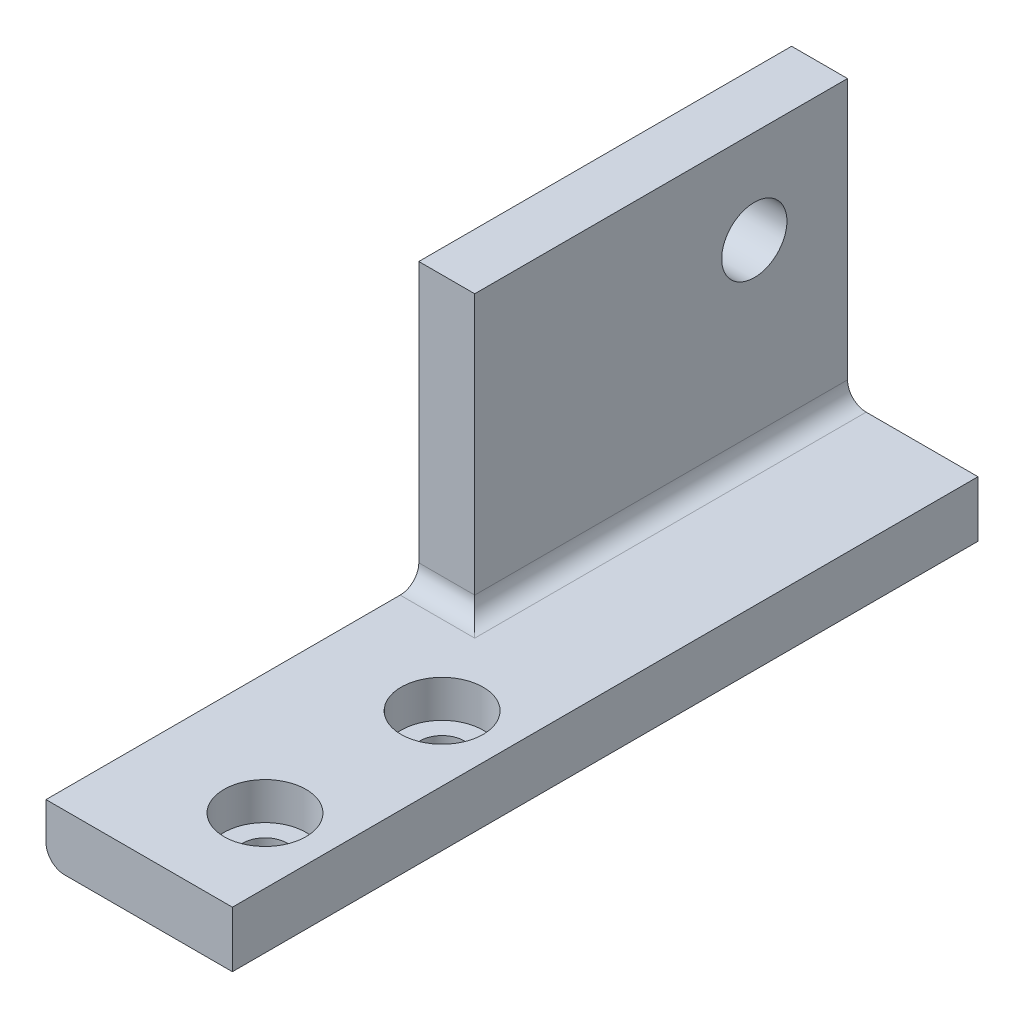
ISO-10303-21;
HEADER;
FILE_DESCRIPTION(('STEP AP214'),'2;1');
FILE_NAME('part.step','',(''),(''),'','','');
FILE_SCHEMA(('AUTOMOTIVE_DESIGN { 1 0 10303 214 1 1 1 1 }'));
ENDSEC;
DATA;
#1=APPLICATION_CONTEXT('core data for automotive mechanical design processes');
#2=APPLICATION_PROTOCOL_DEFINITION('international standard','automotive_design',2000,#1);
#3=PRODUCT_CONTEXT('',#1,'mechanical');
#4=PRODUCT('Part','Part','',(#3));
#5=PRODUCT_RELATED_PRODUCT_CATEGORY('part','',(#4));
#6=PRODUCT_DEFINITION_FORMATION('','',#4);
#7=PRODUCT_DEFINITION_CONTEXT('part definition',#1,'design');
#8=PRODUCT_DEFINITION('design','',#6,#7);
#9=PRODUCT_DEFINITION_SHAPE('','',#8);
#10=(LENGTH_UNIT() NAMED_UNIT(*) SI_UNIT(.MILLI.,.METRE.));
#11=(NAMED_UNIT(*) PLANE_ANGLE_UNIT() SI_UNIT($,.RADIAN.));
#12=(NAMED_UNIT(*) SI_UNIT($,.STERADIAN.) SOLID_ANGLE_UNIT());
#13=UNCERTAINTY_MEASURE_WITH_UNIT(LENGTH_MEASURE(1.E-05),#10,'distance_accuracy_value','');
#14=(GEOMETRIC_REPRESENTATION_CONTEXT(3) GLOBAL_UNCERTAINTY_ASSIGNED_CONTEXT((#13)) GLOBAL_UNIT_ASSIGNED_CONTEXT((#10,
#11,#12)) REPRESENTATION_CONTEXT('',''));
#15=CARTESIAN_POINT('',(0.,0.,0.));
#16=DIRECTION('',(0.,0.,1.));
#17=DIRECTION('',(1.,0.,0.));
#18=AXIS2_PLACEMENT_3D('',#15,#16,#17);
#19=CARTESIAN_POINT('',(0.,3.,0.));
#20=DIRECTION('',(0.,-1.,0.));
#21=DIRECTION('',(0.,0.,-1.));
#22=AXIS2_PLACEMENT_3D('',#19,#20,#21);
#23=PLANE('',#22);
#24=CARTESIAN_POINT('',(6.5,3.,-5.25));
#25=DIRECTION('',(0.,1.,0.));
#26=DIRECTION('',(0.,0.,1.));
#27=AXIS2_PLACEMENT_3D('',#24,#25,#26);
#28=CIRCLE('',#27,2.2);
#29=CARTESIAN_POINT('',(6.5,3.,-3.05));
#30=VERTEX_POINT('',#29);
#31=EDGE_CURVE('E165',#30,#30,#28,.T.);
#32=ORIENTED_EDGE('',*,*,#31,.F.);
#33=EDGE_LOOP('',(#32));
#34=FACE_BOUND('',#33,.T.);
#35=CARTESIAN_POINT('',(6.5,3.,-14.75));
#36=DIRECTION('',(0.,1.,0.));
#37=DIRECTION('',(0.,0.,1.));
#38=AXIS2_PLACEMENT_3D('',#35,#36,#37);
#39=CIRCLE('',#38,2.2);
#40=CARTESIAN_POINT('',(6.5,3.,-12.55));
#41=VERTEX_POINT('',#40);
#42=EDGE_CURVE('E153',#41,#41,#39,.T.);
#43=ORIENTED_EDGE('',*,*,#42,.F.);
#44=EDGE_LOOP('',(#43));
#45=FACE_BOUND('',#44,.T.);
#46=DIRECTION('',(0.,0.,-1.));
#47=VECTOR('',#46,1.);
#48=CARTESIAN_POINT('',(4.,3.,-20.));
#49=LINE('',#48,#47);
#50=CARTESIAN_POINT('',(4.,3.,-40.));
#51=VERTEX_POINT('',#50);
#52=CARTESIAN_POINT('',(4.,3.,-19.));
#53=VERTEX_POINT('',#52);
#54=EDGE_CURVE('E195',#51,#53,#49,.F.);
#55=ORIENTED_EDGE('',*,*,#54,.T.);
#56=DIRECTION('',(1.,0.,0.));
#57=VECTOR('',#56,1.);
#58=CARTESIAN_POINT('',(0.,3.,-19.));
#59=LINE('',#58,#57);
#60=CARTESIAN_POINT('',(0.,3.,-19.));
#61=VERTEX_POINT('',#60);
#62=EDGE_CURVE('E197',#53,#61,#59,.F.);
#63=ORIENTED_EDGE('',*,*,#62,.T.);
#64=DIRECTION('',(0.,0.,1.));
#65=VECTOR('',#64,1.);
#66=CARTESIAN_POINT('',(0.,3.,0.));
#67=LINE('',#66,#65);
#68=CARTESIAN_POINT('',(0.,3.,0.));
#69=VERTEX_POINT('',#68);
#70=EDGE_CURVE('E178',#61,#69,#67,.T.);
#71=ORIENTED_EDGE('',*,*,#70,.T.);
#72=DIRECTION('',(1.,0.,0.));
#73=VECTOR('',#72,1.);
#74=CARTESIAN_POINT('',(0.,3.,0.));
#75=LINE('',#74,#73);
#76=CARTESIAN_POINT('',(10.,3.,0.));
#77=VERTEX_POINT('',#76);
#78=EDGE_CURVE('E180',#69,#77,#75,.T.);
#79=ORIENTED_EDGE('',*,*,#78,.T.);
#80=DIRECTION('',(0.,0.,-1.));
#81=VECTOR('',#80,1.);
#82=CARTESIAN_POINT('',(10.,3.,0.));
#83=LINE('',#82,#81);
#84=CARTESIAN_POINT('',(10.,3.,-40.));
#85=VERTEX_POINT('',#84);
#86=EDGE_CURVE('E183',#77,#85,#83,.T.);
#87=ORIENTED_EDGE('',*,*,#86,.T.);
#88=DIRECTION('',(1.,0.,0.));
#89=VECTOR('',#88,1.);
#90=CARTESIAN_POINT('',(0.,3.,-40.));
#91=LINE('',#90,#89);
#92=EDGE_CURVE('E141',#51,#85,#91,.T.);
#93=ORIENTED_EDGE('',*,*,#92,.F.);
#94=EDGE_LOOP('',(#55,#63,#71,#79,#87,#93));
#95=FACE_BOUND('',#94,.T.);
#96=ADVANCED_FACE('F39',(#34,#45,#95),#23,.F.);
#97=CARTESIAN_POINT('',(0.,0.,0.));
#98=DIRECTION('',(0.,-1.,0.));
#99=DIRECTION('',(0.,0.,-1.));
#100=AXIS2_PLACEMENT_3D('',#97,#98,#99);
#101=PLANE('',#100);
#102=CARTESIAN_POINT('',(6.5,0.,-14.75));
#103=DIRECTION('',(0.,1.,0.));
#104=DIRECTION('',(0.,0.,1.));
#105=AXIS2_PLACEMENT_3D('',#102,#103,#104);
#106=CIRCLE('',#105,1.2);
#107=CARTESIAN_POINT('',(6.5,0.,-13.55));
#108=VERTEX_POINT('',#107);
#109=EDGE_CURVE('E162',#108,#108,#106,.T.);
#110=ORIENTED_EDGE('',*,*,#109,.T.);
#111=EDGE_LOOP('',(#110));
#112=FACE_BOUND('',#111,.T.);
#113=CARTESIAN_POINT('',(6.5,0.,-5.25));
#114=DIRECTION('',(0.,1.,0.));
#115=DIRECTION('',(0.,0.,1.));
#116=AXIS2_PLACEMENT_3D('',#113,#114,#115);
#117=CIRCLE('',#116,1.2);
#118=CARTESIAN_POINT('',(6.5,0.,-4.05));
#119=VERTEX_POINT('',#118);
#120=EDGE_CURVE('E174',#119,#119,#117,.T.);
#121=ORIENTED_EDGE('',*,*,#120,.T.);
#122=EDGE_LOOP('',(#121));
#123=FACE_BOUND('',#122,.T.);
#124=DIRECTION('',(1.,0.,0.));
#125=VECTOR('',#124,1.);
#126=CARTESIAN_POINT('',(0.,0.,0.));
#127=LINE('',#126,#125);
#128=CARTESIAN_POINT('',(1.,0.,0.));
#129=VERTEX_POINT('',#128);
#130=CARTESIAN_POINT('',(10.,0.,0.));
#131=VERTEX_POINT('',#130);
#132=EDGE_CURVE('E177',#129,#131,#127,.T.);
#133=ORIENTED_EDGE('',*,*,#132,.F.);
#134=DIRECTION('',(0.,0.,1.));
#135=VECTOR('',#134,1.);
#136=CARTESIAN_POINT('',(1.,0.,-40.));
#137=LINE('',#136,#135);
#138=CARTESIAN_POINT('',(1.,0.,-40.));
#139=VERTEX_POINT('',#138);
#140=EDGE_CURVE('E47',#129,#139,#137,.F.);
#141=ORIENTED_EDGE('',*,*,#140,.T.);
#142=DIRECTION('',(-1.,0.,0.));
#143=VECTOR('',#142,1.);
#144=CARTESIAN_POINT('',(0.,0.,-40.));
#145=LINE('',#144,#143);
#146=CARTESIAN_POINT('',(10.,0.,-40.));
#147=VERTEX_POINT('',#146);
#148=EDGE_CURVE('E151',#147,#139,#145,.T.);
#149=ORIENTED_EDGE('',*,*,#148,.F.);
#150=DIRECTION('',(0.,0.,-1.));
#151=VECTOR('',#150,1.);
#152=CARTESIAN_POINT('',(10.,0.,0.));
#153=LINE('',#152,#151);
#154=EDGE_CURVE('E181',#131,#147,#153,.T.);
#155=ORIENTED_EDGE('',*,*,#154,.F.);
#156=EDGE_LOOP('',(#133,#141,#149,#155));
#157=FACE_BOUND('',#156,.T.);
#158=ADVANCED_FACE('F240',(#112,#123,#157),#101,.T.);
#159=CARTESIAN_POINT('',(0.,3.,0.));
#160=DIRECTION('',(1.,0.,0.));
#161=DIRECTION('',(0.,0.,-1.));
#162=AXIS2_PLACEMENT_3D('',#159,#160,#161);
#163=PLANE('',#162);
#164=CARTESIAN_POINT('',(0.,13.,-35.));
#165=DIRECTION('',(1.,0.,0.));
#166=DIRECTION('',(0.,0.,-1.));
#167=AXIS2_PLACEMENT_3D('',#164,#165,#166);
#168=CIRCLE('',#167,1.75);
#169=CARTESIAN_POINT('',(0.,13.,-36.75));
#170=VERTEX_POINT('',#169);
#171=EDGE_CURVE('E133',#170,#170,#168,.T.);
#172=ORIENTED_EDGE('',*,*,#171,.T.);
#173=EDGE_LOOP('',(#172));
#174=FACE_BOUND('',#173,.T.);
#175=DIRECTION('',(0.,1.,0.));
#176=VECTOR('',#175,1.);
#177=CARTESIAN_POINT('',(0.,0.,-40.));
#178=LINE('',#177,#176);
#179=CARTESIAN_POINT('',(0.,1.,-40.));
#180=VERTEX_POINT('',#179);
#181=CARTESIAN_POINT('',(0.,18.,-40.));
#182=VERTEX_POINT('',#181);
#183=EDGE_CURVE('E139',#180,#182,#178,.T.);
#184=ORIENTED_EDGE('',*,*,#183,.F.);
#185=DIRECTION('',(0.,0.,1.));
#186=VECTOR('',#185,1.);
#187=CARTESIAN_POINT('',(0.,1.,0.));
#188=LINE('',#187,#186);
#189=CARTESIAN_POINT('',(0.,1.,0.));
#190=VERTEX_POINT('',#189);
#191=EDGE_CURVE('E204',#180,#190,#188,.T.);
#192=ORIENTED_EDGE('',*,*,#191,.T.);
#193=DIRECTION('',(0.,-1.,0.));
#194=VECTOR('',#193,1.);
#195=CARTESIAN_POINT('',(0.,3.,0.));
#196=LINE('',#195,#194);
#197=EDGE_CURVE('E191',#69,#190,#196,.T.);
#198=ORIENTED_EDGE('',*,*,#197,.F.);
#199=ORIENTED_EDGE('',*,*,#70,.F.);
#200=CARTESIAN_POINT('',(0.,4.,-19.));
#201=DIRECTION('',(1.,0.,0.));
#202=DIRECTION('',(0.,0.,-1.));
#203=AXIS2_PLACEMENT_3D('',#200,#201,#202);
#204=CIRCLE('',#203,1.);
#205=CARTESIAN_POINT('',(0.,4.,-20.));
#206=VERTEX_POINT('',#205);
#207=EDGE_CURVE('E138',#61,#206,#204,.T.);
#208=ORIENTED_EDGE('',*,*,#207,.T.);
#209=DIRECTION('',(0.,-1.,0.));
#210=VECTOR('',#209,1.);
#211=CARTESIAN_POINT('',(0.,18.,-20.));
#212=LINE('',#211,#210);
#213=CARTESIAN_POINT('',(0.,18.,-20.));
#214=VERTEX_POINT('',#213);
#215=EDGE_CURVE('E117',#214,#206,#212,.T.);
#216=ORIENTED_EDGE('',*,*,#215,.F.);
#217=DIRECTION('',(0.,0.,1.));
#218=VECTOR('',#217,1.);
#219=CARTESIAN_POINT('',(0.,18.,-40.));
#220=LINE('',#219,#218);
#221=EDGE_CURVE('E124',#182,#214,#220,.T.);
#222=ORIENTED_EDGE('',*,*,#221,.F.);
#223=EDGE_LOOP('',(#184,#192,#198,#199,#208,#216,#222));
#224=FACE_BOUND('',#223,.T.);
#225=ADVANCED_FACE('F135',(#174,#224),#163,.F.);
#226=CARTESIAN_POINT('',(0.,3.,0.));
#227=DIRECTION('',(0.,0.,-1.));
#228=DIRECTION('',(-1.,0.,0.));
#229=AXIS2_PLACEMENT_3D('',#226,#227,#228);
#230=PLANE('',#229);
#231=ORIENTED_EDGE('',*,*,#197,.T.);
#232=CARTESIAN_POINT('',(1.,1.,0.));
#233=DIRECTION('',(0.,0.,-1.));
#234=DIRECTION('',(-1.,0.,0.));
#235=AXIS2_PLACEMENT_3D('',#232,#233,#234);
#236=CIRCLE('',#235,1.);
#237=EDGE_CURVE('E61',#190,#129,#236,.F.);
#238=ORIENTED_EDGE('',*,*,#237,.T.);
#239=ORIENTED_EDGE('',*,*,#132,.T.);
#240=DIRECTION('',(0.,-1.,0.));
#241=VECTOR('',#240,1.);
#242=CARTESIAN_POINT('',(10.,3.,0.));
#243=LINE('',#242,#241);
#244=EDGE_CURVE('E186',#77,#131,#243,.T.);
#245=ORIENTED_EDGE('',*,*,#244,.F.);
#246=ORIENTED_EDGE('',*,*,#78,.F.);
#247=EDGE_LOOP('',(#231,#238,#239,#245,#246));
#248=FACE_BOUND('',#247,.T.);
#249=ADVANCED_FACE('F215',(#248),#230,.F.);
#250=CARTESIAN_POINT('',(10.,3.,0.));
#251=DIRECTION('',(-1.,0.,0.));
#252=DIRECTION('',(0.,0.,1.));
#253=AXIS2_PLACEMENT_3D('',#250,#251,#252);
#254=PLANE('',#253);
#255=ORIENTED_EDGE('',*,*,#154,.T.);
#256=DIRECTION('',(0.,-1.,0.));
#257=VECTOR('',#256,1.);
#258=CARTESIAN_POINT('',(10.,0.,-40.));
#259=LINE('',#258,#257);
#260=EDGE_CURVE('E148',#85,#147,#259,.T.);
#261=ORIENTED_EDGE('',*,*,#260,.F.);
#262=ORIENTED_EDGE('',*,*,#86,.F.);
#263=ORIENTED_EDGE('',*,*,#244,.T.);
#264=EDGE_LOOP('',(#255,#261,#262,#263));
#265=FACE_BOUND('',#264,.T.);
#266=ADVANCED_FACE('F241',(#265),#254,.F.);
#267=CARTESIAN_POINT('',(6.5,3.,-5.25));
#268=DIRECTION('',(0.,1.,0.));
#269=DIRECTION('',(0.,0.,1.));
#270=AXIS2_PLACEMENT_3D('',#267,#268,#269);
#271=CYLINDRICAL_SURFACE('',#270,1.2);
#272=ORIENTED_EDGE('',*,*,#120,.F.);
#273=EDGE_LOOP('',(#272));
#274=FACE_BOUND('',#273,.T.);
#275=CARTESIAN_POINT('',(6.5,1.,-5.25));
#276=DIRECTION('',(0.,1.,0.));
#277=DIRECTION('',(0.,0.,1.));
#278=AXIS2_PLACEMENT_3D('',#275,#276,#277);
#279=CIRCLE('',#278,1.2);
#280=CARTESIAN_POINT('',(6.5,1.,-4.05));
#281=VERTEX_POINT('',#280);
#282=EDGE_CURVE('E171',#281,#281,#279,.T.);
#283=ORIENTED_EDGE('',*,*,#282,.T.);
#284=EDGE_LOOP('',(#283));
#285=FACE_BOUND('',#284,.T.);
#286=ADVANCED_FACE('F243',(#274,#285),#271,.F.);
#287=CARTESIAN_POINT('',(7.7,1.,-5.25));
#288=DIRECTION('',(0.,-1.,0.));
#289=DIRECTION('',(0.,0.,-1.));
#290=AXIS2_PLACEMENT_3D('',#287,#288,#289);
#291=PLANE('',#290);
#292=ORIENTED_EDGE('',*,*,#282,.F.);
#293=EDGE_LOOP('',(#292));
#294=FACE_BOUND('',#293,.T.);
#295=CARTESIAN_POINT('',(6.5,1.,-5.25));
#296=DIRECTION('',(0.,1.,0.));
#297=DIRECTION('',(0.,0.,1.));
#298=AXIS2_PLACEMENT_3D('',#295,#296,#297);
#299=CIRCLE('',#298,2.2);
#300=CARTESIAN_POINT('',(6.5,1.,-3.05));
#301=VERTEX_POINT('',#300);
#302=EDGE_CURVE('E168',#301,#301,#299,.T.);
#303=ORIENTED_EDGE('',*,*,#302,.T.);
#304=EDGE_LOOP('',(#303));
#305=FACE_BOUND('',#304,.T.);
#306=ADVANCED_FACE('F250',(#294,#305),#291,.F.);
#307=CARTESIAN_POINT('',(6.5,3.,-5.25));
#308=DIRECTION('',(0.,1.,0.));
#309=DIRECTION('',(0.,0.,1.));
#310=AXIS2_PLACEMENT_3D('',#307,#308,#309);
#311=CYLINDRICAL_SURFACE('',#310,2.2);
#312=ORIENTED_EDGE('',*,*,#302,.F.);
#313=EDGE_LOOP('',(#312));
#314=FACE_BOUND('',#313,.T.);
#315=ORIENTED_EDGE('',*,*,#31,.T.);
#316=EDGE_LOOP('',(#315));
#317=FACE_BOUND('',#316,.T.);
#318=ADVANCED_FACE('F270',(#314,#317),#311,.F.);
#319=CARTESIAN_POINT('',(6.5,3.,-14.75));
#320=DIRECTION('',(0.,1.,0.));
#321=DIRECTION('',(0.,0.,1.));
#322=AXIS2_PLACEMENT_3D('',#319,#320,#321);
#323=CYLINDRICAL_SURFACE('',#322,1.2);
#324=ORIENTED_EDGE('',*,*,#109,.F.);
#325=EDGE_LOOP('',(#324));
#326=FACE_BOUND('',#325,.T.);
#327=CARTESIAN_POINT('',(6.5,1.,-14.75));
#328=DIRECTION('',(0.,1.,0.));
#329=DIRECTION('',(0.,0.,1.));
#330=AXIS2_PLACEMENT_3D('',#327,#328,#329);
#331=CIRCLE('',#330,1.2);
#332=CARTESIAN_POINT('',(6.5,1.,-13.55));
#333=VERTEX_POINT('',#332);
#334=EDGE_CURVE('E159',#333,#333,#331,.T.);
#335=ORIENTED_EDGE('',*,*,#334,.T.);
#336=EDGE_LOOP('',(#335));
#337=FACE_BOUND('',#336,.T.);
#338=ADVANCED_FACE('F274',(#326,#337),#323,.F.);
#339=CARTESIAN_POINT('',(7.7,1.,-14.75));
#340=DIRECTION('',(0.,-1.,0.));
#341=DIRECTION('',(0.,0.,-1.));
#342=AXIS2_PLACEMENT_3D('',#339,#340,#341);
#343=PLANE('',#342);
#344=ORIENTED_EDGE('',*,*,#334,.F.);
#345=EDGE_LOOP('',(#344));
#346=FACE_BOUND('',#345,.T.);
#347=CARTESIAN_POINT('',(6.5,1.,-14.75));
#348=DIRECTION('',(0.,1.,0.));
#349=DIRECTION('',(0.,0.,1.));
#350=AXIS2_PLACEMENT_3D('',#347,#348,#349);
#351=CIRCLE('',#350,2.2);
#352=CARTESIAN_POINT('',(6.5,1.,-12.55));
#353=VERTEX_POINT('',#352);
#354=EDGE_CURVE('E156',#353,#353,#351,.T.);
#355=ORIENTED_EDGE('',*,*,#354,.T.);
#356=EDGE_LOOP('',(#355));
#357=FACE_BOUND('',#356,.T.);
#358=ADVANCED_FACE('F278',(#346,#357),#343,.F.);
#359=CARTESIAN_POINT('',(6.5,3.,-14.75));
#360=DIRECTION('',(0.,1.,0.));
#361=DIRECTION('',(0.,0.,1.));
#362=AXIS2_PLACEMENT_3D('',#359,#360,#361);
#363=CYLINDRICAL_SURFACE('',#362,2.2);
#364=ORIENTED_EDGE('',*,*,#354,.F.);
#365=EDGE_LOOP('',(#364));
#366=FACE_BOUND('',#365,.T.);
#367=ORIENTED_EDGE('',*,*,#42,.T.);
#368=EDGE_LOOP('',(#367));
#369=FACE_BOUND('',#368,.T.);
#370=ADVANCED_FACE('F282',(#366,#369),#363,.F.);
#371=CARTESIAN_POINT('',(0.,0.,-40.));
#372=DIRECTION('',(0.,0.,-1.));
#373=DIRECTION('',(-1.,0.,0.));
#374=AXIS2_PLACEMENT_3D('',#371,#372,#373);
#375=PLANE('',#374);
#376=ORIENTED_EDGE('',*,*,#148,.T.);
#377=CARTESIAN_POINT('',(1.,1.,-40.));
#378=DIRECTION('',(0.,0.,-1.));
#379=DIRECTION('',(-1.,0.,0.));
#380=AXIS2_PLACEMENT_3D('',#377,#378,#379);
#381=CIRCLE('',#380,1.);
#382=EDGE_CURVE('E11',#139,#180,#381,.T.);
#383=ORIENTED_EDGE('',*,*,#382,.T.);
#384=ORIENTED_EDGE('',*,*,#183,.T.);
#385=DIRECTION('',(-1.,0.,0.));
#386=VECTOR('',#385,1.);
#387=CARTESIAN_POINT('',(0.,18.,-40.));
#388=LINE('',#387,#386);
#389=CARTESIAN_POINT('',(3.,18.,-40.));
#390=VERTEX_POINT('',#389);
#391=EDGE_CURVE('E130',#390,#182,#388,.T.);
#392=ORIENTED_EDGE('',*,*,#391,.F.);
#393=DIRECTION('',(0.,-1.,0.));
#394=VECTOR('',#393,1.);
#395=CARTESIAN_POINT('',(3.,18.,-40.));
#396=LINE('',#395,#394);
#397=CARTESIAN_POINT('',(3.,4.,-40.));
#398=VERTEX_POINT('',#397);
#399=EDGE_CURVE('E143',#390,#398,#396,.T.);
#400=ORIENTED_EDGE('',*,*,#399,.T.);
#401=CARTESIAN_POINT('',(4.,4.,-40.));
#402=DIRECTION('',(0.,0.,-1.));
#403=DIRECTION('',(-1.,0.,0.));
#404=AXIS2_PLACEMENT_3D('',#401,#402,#403);
#405=CIRCLE('',#404,1.);
#406=EDGE_CURVE('E202',#398,#51,#405,.F.);
#407=ORIENTED_EDGE('',*,*,#406,.T.);
#408=ORIENTED_EDGE('',*,*,#92,.T.);
#409=ORIENTED_EDGE('',*,*,#260,.T.);
#410=EDGE_LOOP('',(#376,#383,#384,#392,#400,#407,#408,#409));
#411=FACE_BOUND('',#410,.T.);
#412=ADVANCED_FACE('F234',(#411),#375,.T.);
#413=CARTESIAN_POINT('',(0.,18.,-20.));
#414=DIRECTION('',(0.,0.,-1.));
#415=DIRECTION('',(-1.,0.,0.));
#416=AXIS2_PLACEMENT_3D('',#413,#414,#415);
#417=PLANE('',#416);
#418=ORIENTED_EDGE('',*,*,#215,.T.);
#419=DIRECTION('',(1.,0.,0.));
#420=VECTOR('',#419,1.);
#421=CARTESIAN_POINT('',(3.,4.,-20.));
#422=LINE('',#421,#420);
#423=CARTESIAN_POINT('',(3.,4.,-20.));
#424=VERTEX_POINT('',#423);
#425=EDGE_CURVE('E193',#206,#424,#422,.T.);
#426=ORIENTED_EDGE('',*,*,#425,.T.);
#427=DIRECTION('',(0.,-1.,0.));
#428=VECTOR('',#427,1.);
#429=CARTESIAN_POINT('',(3.,18.,-20.));
#430=LINE('',#429,#428);
#431=CARTESIAN_POINT('',(3.,18.,-20.));
#432=VERTEX_POINT('',#431);
#433=EDGE_CURVE('E120',#432,#424,#430,.T.);
#434=ORIENTED_EDGE('',*,*,#433,.F.);
#435=DIRECTION('',(1.,0.,0.));
#436=VECTOR('',#435,1.);
#437=CARTESIAN_POINT('',(0.,18.,-20.));
#438=LINE('',#437,#436);
#439=EDGE_CURVE('E112',#214,#432,#438,.T.);
#440=ORIENTED_EDGE('',*,*,#439,.F.);
#441=EDGE_LOOP('',(#418,#426,#434,#440));
#442=FACE_BOUND('',#441,.T.);
#443=ADVANCED_FACE('F114',(#442),#417,.F.);
#444=CARTESIAN_POINT('',(3.,18.,-40.));
#445=DIRECTION('',(-1.,0.,0.));
#446=DIRECTION('',(0.,0.,1.));
#447=AXIS2_PLACEMENT_3D('',#444,#445,#446);
#448=PLANE('',#447);
#449=CARTESIAN_POINT('',(3.,13.,-35.));
#450=DIRECTION('',(1.,0.,0.));
#451=DIRECTION('',(0.,0.,-1.));
#452=AXIS2_PLACEMENT_3D('',#449,#450,#451);
#453=CIRCLE('',#452,1.75);
#454=CARTESIAN_POINT('',(3.,13.,-36.75));
#455=VERTEX_POINT('',#454);
#456=EDGE_CURVE('E207',#455,#455,#453,.T.);
#457=ORIENTED_EDGE('',*,*,#456,.F.);
#458=EDGE_LOOP('',(#457));
#459=FACE_BOUND('',#458,.T.);
#460=ORIENTED_EDGE('',*,*,#433,.T.);
#461=DIRECTION('',(0.,0.,-1.));
#462=VECTOR('',#461,1.);
#463=CARTESIAN_POINT('',(3.,4.,-40.));
#464=LINE('',#463,#462);
#465=EDGE_CURVE('E199',#424,#398,#464,.T.);
#466=ORIENTED_EDGE('',*,*,#465,.T.);
#467=ORIENTED_EDGE('',*,*,#399,.F.);
#468=DIRECTION('',(0.,0.,-1.));
#469=VECTOR('',#468,1.);
#470=CARTESIAN_POINT('',(3.,18.,-40.));
#471=LINE('',#470,#469);
#472=EDGE_CURVE('E123',#432,#390,#471,.T.);
#473=ORIENTED_EDGE('',*,*,#472,.F.);
#474=EDGE_LOOP('',(#460,#466,#467,#473));
#475=FACE_BOUND('',#474,.T.);
#476=ADVANCED_FACE('F227',(#459,#475),#448,.F.);
#477=CARTESIAN_POINT('',(0.,18.,0.));
#478=DIRECTION('',(0.,1.,0.));
#479=DIRECTION('',(0.,0.,1.));
#480=AXIS2_PLACEMENT_3D('',#477,#478,#479);
#481=PLANE('',#480);
#482=ORIENTED_EDGE('',*,*,#221,.T.);
#483=ORIENTED_EDGE('',*,*,#439,.T.);
#484=ORIENTED_EDGE('',*,*,#472,.T.);
#485=ORIENTED_EDGE('',*,*,#391,.T.);
#486=EDGE_LOOP('',(#482,#483,#484,#485));
#487=FACE_BOUND('',#486,.T.);
#488=ADVANCED_FACE('F128',(#487),#481,.T.);
#489=CARTESIAN_POINT('',(0.,13.,-35.));
#490=DIRECTION('',(1.,0.,0.));
#491=DIRECTION('',(0.,0.,-1.));
#492=AXIS2_PLACEMENT_3D('',#489,#490,#491);
#493=CYLINDRICAL_SURFACE('',#492,1.75);
#494=ORIENTED_EDGE('',*,*,#171,.F.);
#495=EDGE_LOOP('',(#494));
#496=FACE_BOUND('',#495,.T.);
#497=ORIENTED_EDGE('',*,*,#456,.T.);
#498=EDGE_LOOP('',(#497));
#499=FACE_BOUND('',#498,.T.);
#500=ADVANCED_FACE('F293',(#496,#499),#493,.F.);
#501=CARTESIAN_POINT('',(4.,4.,-40.));
#502=DIRECTION('',(0.,0.,1.));
#503=DIRECTION('',(1.,0.,0.));
#504=AXIS2_PLACEMENT_3D('',#501,#502,#503);
#505=CYLINDRICAL_SURFACE('',#504,1.);
#506=ORIENTED_EDGE('',*,*,#406,.F.);
#507=ORIENTED_EDGE('',*,*,#465,.F.);
#508=CARTESIAN_POINT('',(4.,4.,-19.));
#509=DIRECTION('',(-0.707106781186547,0.,0.707106781186548));
#510=DIRECTION('',(0.707106781186548,0.,0.707106781186547));
#511=AXIS2_PLACEMENT_3D('',#508,#509,#510);
#512=ELLIPSE('',#511,1.4142135623731,1.);
#513=EDGE_CURVE('E205',#53,#424,#512,.F.);
#514=ORIENTED_EDGE('',*,*,#513,.F.);
#515=ORIENTED_EDGE('',*,*,#54,.F.);
#516=EDGE_LOOP('',(#506,#507,#514,#515));
#517=FACE_BOUND('',#516,.T.);
#518=ADVANCED_FACE('F237',(#517),#505,.F.);
#519=CARTESIAN_POINT('',(0.,4.,-19.));
#520=DIRECTION('',(-1.,0.,0.));
#521=DIRECTION('',(0.,0.,1.));
#522=AXIS2_PLACEMENT_3D('',#519,#520,#521);
#523=CYLINDRICAL_SURFACE('',#522,1.);
#524=ORIENTED_EDGE('',*,*,#207,.F.);
#525=ORIENTED_EDGE('',*,*,#62,.F.);
#526=ORIENTED_EDGE('',*,*,#513,.T.);
#527=ORIENTED_EDGE('',*,*,#425,.F.);
#528=EDGE_LOOP('',(#524,#525,#526,#527));
#529=FACE_BOUND('',#528,.T.);
#530=ADVANCED_FACE('F223',(#529),#523,.F.);
#531=CARTESIAN_POINT('',(1.,1.,0.));
#532=DIRECTION('',(0.,0.,-1.));
#533=DIRECTION('',(-1.,0.,0.));
#534=AXIS2_PLACEMENT_3D('',#531,#532,#533);
#535=CYLINDRICAL_SURFACE('',#534,1.);
#536=ORIENTED_EDGE('',*,*,#382,.F.);
#537=ORIENTED_EDGE('',*,*,#140,.F.);
#538=ORIENTED_EDGE('',*,*,#237,.F.);
#539=ORIENTED_EDGE('',*,*,#191,.F.);
#540=EDGE_LOOP('',(#536,#537,#538,#539));
#541=FACE_BOUND('',#540,.T.);
#542=ADVANCED_FACE('F41',(#541),#535,.T.);
#543=CLOSED_SHELL('',(#96,#158,#225,#249,#266,#286,#306,#318,#338,#358,#370,#412,#443,#476,#488,
#500,#518,#530,#542));
#544=MANIFOLD_SOLID_BREP('B2',#543);
#545=ADVANCED_BREP_SHAPE_REPRESENTATION('',(#18,#544),#14);
#546=SHAPE_DEFINITION_REPRESENTATION(#9,#545);
ENDSEC;
END-ISO-10303-21;
